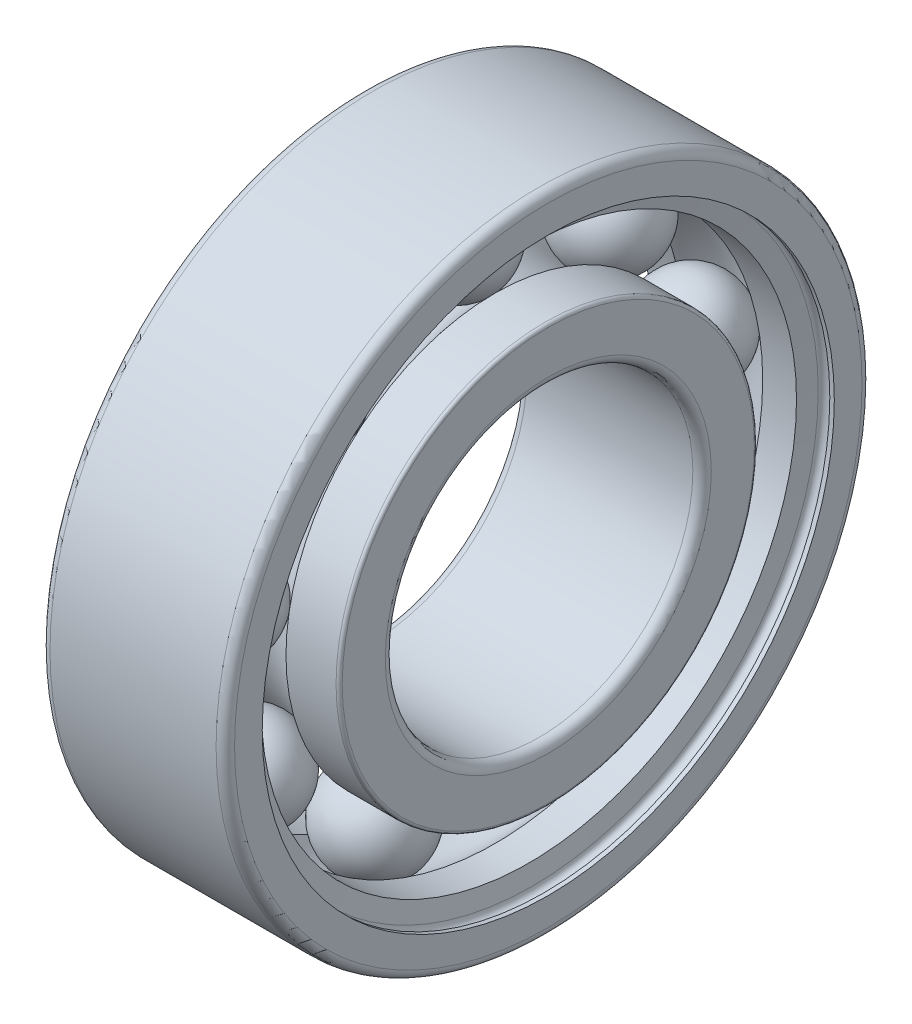
ISO-10303-21;
HEADER;
FILE_DESCRIPTION(('STEP AP214'),'2;1');
FILE_NAME('part.step','',(''),(''),'','','');
FILE_SCHEMA(('AUTOMOTIVE_DESIGN { 1 0 10303 214 1 1 1 1 }'));
ENDSEC;
DATA;
#1=APPLICATION_CONTEXT('core data for automotive mechanical design processes');
#2=APPLICATION_PROTOCOL_DEFINITION('international standard','automotive_design',2000,#1);
#3=PRODUCT_CONTEXT('',#1,'mechanical');
#4=PRODUCT('Part','Part','',(#3));
#5=PRODUCT_RELATED_PRODUCT_CATEGORY('part','',(#4));
#6=PRODUCT_DEFINITION_FORMATION('','',#4);
#7=PRODUCT_DEFINITION_CONTEXT('part definition',#1,'design');
#8=PRODUCT_DEFINITION('design','',#6,#7);
#9=PRODUCT_DEFINITION_SHAPE('','',#8);
#10=(LENGTH_UNIT() NAMED_UNIT(*) SI_UNIT(.MILLI.,.METRE.));
#11=(NAMED_UNIT(*) PLANE_ANGLE_UNIT() SI_UNIT($,.RADIAN.));
#12=(NAMED_UNIT(*) SI_UNIT($,.STERADIAN.) SOLID_ANGLE_UNIT());
#13=UNCERTAINTY_MEASURE_WITH_UNIT(LENGTH_MEASURE(1.E-05),#10,'distance_accuracy_value','');
#14=(GEOMETRIC_REPRESENTATION_CONTEXT(3) GLOBAL_UNCERTAINTY_ASSIGNED_CONTEXT((#13)) GLOBAL_UNIT_ASSIGNED_CONTEXT((#10,
#11,#12)) REPRESENTATION_CONTEXT('',''));
#15=CARTESIAN_POINT('',(0.,0.,0.));
#16=DIRECTION('',(0.,0.,1.));
#17=DIRECTION('',(1.,0.,0.));
#18=AXIS2_PLACEMENT_3D('',#15,#16,#17);
#19=CARTESIAN_POINT('',(0.599999999999877,0.,0.));
#20=DIRECTION('',(1.,0.,0.));
#21=DIRECTION('',(0.,0.,-1.));
#22=AXIS2_PLACEMENT_3D('',#19,#20,#21);
#23=TOROIDAL_SURFACE('',#22,10.5999999999999,0.599999999999877);
#24=CARTESIAN_POINT('',(0.6,0.,0.));
#25=DIRECTION('',(1.,0.,0.));
#26=DIRECTION('',(0.,0.,-1.));
#27=AXIS2_PLACEMENT_3D('',#24,#25,#26);
#28=CIRCLE('',#27,10.);
#29=CARTESIAN_POINT('',(0.6,0.,-10.));
#30=VERTEX_POINT('',#29);
#31=EDGE_CURVE('P0_E10',#30,#30,#28,.T.);
#32=ORIENTED_EDGE('',*,*,#31,.T.);
#33=EDGE_LOOP('',(#32));
#34=FACE_BOUND('',#33,.T.);
#35=CARTESIAN_POINT('',(0.,0.,0.));
#36=DIRECTION('',(1.,0.,0.));
#37=DIRECTION('',(0.,0.,-1.));
#38=AXIS2_PLACEMENT_3D('',#35,#36,#37);
#39=CIRCLE('',#38,10.6);
#40=CARTESIAN_POINT('',(0.,0.,-10.6));
#41=VERTEX_POINT('',#40);
#42=EDGE_CURVE('P0_E48',#41,#41,#39,.T.);
#43=ORIENTED_EDGE('',*,*,#42,.F.);
#44=EDGE_LOOP('',(#43));
#45=FACE_BOUND('',#44,.T.);
#46=ADVANCED_FACE('P0_F14',(#34,#45),#23,.T.);
#47=CARTESIAN_POINT('',(11.4,0.,0.));
#48=DIRECTION('',(1.,0.,0.));
#49=DIRECTION('',(0.,0.,-1.));
#50=AXIS2_PLACEMENT_3D('',#47,#48,#49);
#51=CYLINDRICAL_SURFACE('',#50,10.);
#52=CARTESIAN_POINT('',(11.4,0.,0.));
#53=DIRECTION('',(1.,0.,0.));
#54=DIRECTION('',(0.,0.,-1.));
#55=AXIS2_PLACEMENT_3D('',#52,#53,#54);
#56=CIRCLE('',#55,10.);
#57=CARTESIAN_POINT('',(11.4,0.,-10.));
#58=VERTEX_POINT('',#57);
#59=EDGE_CURVE('P0_E20',#58,#58,#56,.T.);
#60=ORIENTED_EDGE('',*,*,#59,.T.);
#61=EDGE_LOOP('',(#60));
#62=FACE_BOUND('',#61,.T.);
#63=ORIENTED_EDGE('',*,*,#31,.F.);
#64=EDGE_LOOP('',(#63));
#65=FACE_BOUND('',#64,.T.);
#66=ADVANCED_FACE('P0_F56',(#62,#65),#51,.F.);
#67=CARTESIAN_POINT('',(11.4000000000002,0.,0.));
#68=DIRECTION('',(1.,0.,0.));
#69=DIRECTION('',(0.,0.,-1.));
#70=AXIS2_PLACEMENT_3D('',#67,#68,#69);
#71=TOROIDAL_SURFACE('',#70,10.5999999999998,0.599999999999754);
#72=CARTESIAN_POINT('',(12.,0.,0.));
#73=DIRECTION('',(1.,0.,0.));
#74=DIRECTION('',(0.,0.,-1.));
#75=AXIS2_PLACEMENT_3D('',#72,#73,#74);
#76=CIRCLE('',#75,10.6);
#77=CARTESIAN_POINT('',(12.,0.,-10.6));
#78=VERTEX_POINT('',#77);
#79=EDGE_CURVE('P0_E24',#78,#78,#76,.T.);
#80=ORIENTED_EDGE('',*,*,#79,.T.);
#81=EDGE_LOOP('',(#80));
#82=FACE_BOUND('',#81,.T.);
#83=ORIENTED_EDGE('',*,*,#59,.F.);
#84=EDGE_LOOP('',(#83));
#85=FACE_BOUND('',#84,.T.);
#86=ADVANCED_FACE('P0_F61',(#82,#85),#71,.T.);
#87=CARTESIAN_POINT('',(12.,10.6,0.));
#88=DIRECTION('',(1.,0.,0.));
#89=DIRECTION('',(0.,0.,-1.));
#90=AXIS2_PLACEMENT_3D('',#87,#88,#89);
#91=PLANE('',#90);
#92=CARTESIAN_POINT('',(12.,0.,0.));
#93=DIRECTION('',(1.,0.,0.));
#94=DIRECTION('',(0.,0.,-1.));
#95=AXIS2_PLACEMENT_3D('',#92,#93,#94);
#96=CIRCLE('',#95,13.4);
#97=CARTESIAN_POINT('',(12.,0.,-13.4));
#98=VERTEX_POINT('',#97);
#99=EDGE_CURVE('P0_E28',#98,#98,#96,.T.);
#100=ORIENTED_EDGE('',*,*,#99,.T.);
#101=EDGE_LOOP('',(#100));
#102=FACE_BOUND('',#101,.T.);
#103=ORIENTED_EDGE('',*,*,#79,.F.);
#104=EDGE_LOOP('',(#103));
#105=FACE_BOUND('',#104,.T.);
#106=ADVANCED_FACE('P0_F65',(#102,#105),#91,.T.);
#107=CARTESIAN_POINT('',(11.7999999999989,0.,0.));
#108=DIRECTION('',(1.,0.,0.));
#109=DIRECTION('',(0.,0.,-1.));
#110=AXIS2_PLACEMENT_3D('',#107,#108,#109);
#111=TOROIDAL_SURFACE('',#110,13.3999999999989,0.200000000001057);
#112=CARTESIAN_POINT('',(11.8,0.,0.));
#113=DIRECTION('',(1.,0.,0.));
#114=DIRECTION('',(0.,0.,-1.));
#115=AXIS2_PLACEMENT_3D('',#112,#113,#114);
#116=CIRCLE('',#115,13.6);
#117=CARTESIAN_POINT('',(11.8,0.,-13.6));
#118=VERTEX_POINT('',#117);
#119=EDGE_CURVE('P0_E33',#118,#118,#116,.T.);
#120=ORIENTED_EDGE('',*,*,#119,.T.);
#121=EDGE_LOOP('',(#120));
#122=FACE_BOUND('',#121,.T.);
#123=ORIENTED_EDGE('',*,*,#99,.F.);
#124=EDGE_LOOP('',(#123));
#125=FACE_BOUND('',#124,.T.);
#126=ADVANCED_FACE('P0_F72',(#122,#125),#111,.T.);
#127=CARTESIAN_POINT('',(11.4,0.,0.));
#128=DIRECTION('',(1.,0.,0.));
#129=DIRECTION('',(0.,0.,-1.));
#130=AXIS2_PLACEMENT_3D('',#127,#128,#129);
#131=CYLINDRICAL_SURFACE('',#130,13.6);
#132=CARTESIAN_POINT('',(8.5437423218557,0.,0.));
#133=DIRECTION('',(1.,0.,0.));
#134=DIRECTION('',(0.,0.,-1.));
#135=AXIS2_PLACEMENT_3D('',#132,#133,#134);
#136=CIRCLE('',#135,13.6);
#137=CARTESIAN_POINT('',(8.5437423218557,0.,-13.6));
#138=VERTEX_POINT('',#137);
#139=EDGE_CURVE('P0_E36',#138,#138,#136,.T.);
#140=ORIENTED_EDGE('',*,*,#139,.T.);
#141=EDGE_LOOP('',(#140));
#142=FACE_BOUND('',#141,.T.);
#143=ORIENTED_EDGE('',*,*,#119,.F.);
#144=EDGE_LOOP('',(#143));
#145=FACE_BOUND('',#144,.T.);
#146=ADVANCED_FACE('P0_F76',(#142,#145),#131,.T.);
#147=CARTESIAN_POINT('',(6.,0.,0.));
#148=DIRECTION('',(1.,0.,0.));
#149=DIRECTION('',(0.,0.,-1.));
#150=AXIS2_PLACEMENT_3D('',#147,#148,#149);
#151=TOROIDAL_SURFACE('',#150,15.4999999999999,3.17499999999993);
#152=CARTESIAN_POINT('',(3.4562576781443,0.,0.));
#153=DIRECTION('',(1.,0.,0.));
#154=DIRECTION('',(0.,0.,-1.));
#155=AXIS2_PLACEMENT_3D('',#152,#153,#154);
#156=CIRCLE('',#155,13.6);
#157=CARTESIAN_POINT('',(3.4562576781443,0.,-13.6));
#158=VERTEX_POINT('',#157);
#159=EDGE_CURVE('P0_E39',#158,#158,#156,.T.);
#160=ORIENTED_EDGE('',*,*,#159,.T.);
#161=EDGE_LOOP('',(#160));
#162=FACE_BOUND('',#161,.T.);
#163=ORIENTED_EDGE('',*,*,#139,.F.);
#164=EDGE_LOOP('',(#163));
#165=FACE_BOUND('',#164,.T.);
#166=ADVANCED_FACE('P0_F80',(#162,#165),#151,.F.);
#167=CARTESIAN_POINT('',(11.4,0.,0.));
#168=DIRECTION('',(1.,0.,0.));
#169=DIRECTION('',(0.,0.,-1.));
#170=AXIS2_PLACEMENT_3D('',#167,#168,#169);
#171=CYLINDRICAL_SURFACE('',#170,13.6);
#172=CARTESIAN_POINT('',(0.200000000000001,0.,0.));
#173=DIRECTION('',(1.,0.,0.));
#174=DIRECTION('',(0.,0.,-1.));
#175=AXIS2_PLACEMENT_3D('',#172,#173,#174);
#176=CIRCLE('',#175,13.6);
#177=CARTESIAN_POINT('',(0.200000000000001,0.,-13.6));
#178=VERTEX_POINT('',#177);
#179=EDGE_CURVE('P0_E42',#178,#178,#176,.T.);
#180=ORIENTED_EDGE('',*,*,#179,.T.);
#181=EDGE_LOOP('',(#180));
#182=FACE_BOUND('',#181,.T.);
#183=ORIENTED_EDGE('',*,*,#159,.F.);
#184=EDGE_LOOP('',(#183));
#185=FACE_BOUND('',#184,.T.);
#186=ADVANCED_FACE('P0_F84',(#182,#185),#171,.T.);
#187=CARTESIAN_POINT('',(0.200000000000528,0.,0.));
#188=DIRECTION('',(1.,0.,0.));
#189=DIRECTION('',(0.,0.,-1.));
#190=AXIS2_PLACEMENT_3D('',#187,#188,#189);
#191=TOROIDAL_SURFACE('',#190,13.3999999999995,0.200000000000528);
#192=CARTESIAN_POINT('',(0.,0.,0.));
#193=DIRECTION('',(1.,0.,0.));
#194=DIRECTION('',(0.,0.,-1.));
#195=AXIS2_PLACEMENT_3D('',#192,#193,#194);
#196=CIRCLE('',#195,13.4);
#197=CARTESIAN_POINT('',(0.,0.,-13.4));
#198=VERTEX_POINT('',#197);
#199=EDGE_CURVE('P0_E45',#198,#198,#196,.T.);
#200=ORIENTED_EDGE('',*,*,#199,.T.);
#201=EDGE_LOOP('',(#200));
#202=FACE_BOUND('',#201,.T.);
#203=ORIENTED_EDGE('',*,*,#179,.F.);
#204=EDGE_LOOP('',(#203));
#205=FACE_BOUND('',#204,.T.);
#206=ADVANCED_FACE('P0_F88',(#202,#205),#191,.T.);
#207=CARTESIAN_POINT('',(0.,13.4,0.));
#208=DIRECTION('',(-1.,0.,0.));
#209=DIRECTION('',(0.,0.,1.));
#210=AXIS2_PLACEMENT_3D('',#207,#208,#209);
#211=PLANE('',#210);
#212=ORIENTED_EDGE('',*,*,#42,.T.);
#213=EDGE_LOOP('',(#212));
#214=FACE_BOUND('',#213,.T.);
#215=ORIENTED_EDGE('',*,*,#199,.F.);
#216=EDGE_LOOP('',(#215));
#217=FACE_BOUND('',#216,.T.);
#218=ADVANCED_FACE('P0_F52',(#214,#217),#211,.T.);
#219=CLOSED_SHELL('',(#46,#66,#86,#106,#126,#146,#166,#186,#206,#218));
#220=MANIFOLD_SOLID_BREP('P0_B1',#219);
#221=CARTESIAN_POINT('',(0.599999999999877,0.,0.));
#222=DIRECTION('',(1.,0.,0.));
#223=DIRECTION('',(0.,0.,-1.));
#224=AXIS2_PLACEMENT_3D('',#221,#222,#223);
#225=TOROIDAL_SURFACE('',#224,20.4000000000001,0.599999999999876);
#226=CARTESIAN_POINT('',(0.,0.,0.));
#227=DIRECTION('',(1.,0.,0.));
#228=DIRECTION('',(0.,0.,-1.));
#229=AXIS2_PLACEMENT_3D('',#226,#227,#228);
#230=CIRCLE('',#229,20.4);
#231=CARTESIAN_POINT('',(0.,0.,-20.4));
#232=VERTEX_POINT('',#231);
#233=EDGE_CURVE('P1_E10',#232,#232,#230,.T.);
#234=ORIENTED_EDGE('',*,*,#233,.T.);
#235=EDGE_LOOP('',(#234));
#236=FACE_BOUND('',#235,.T.);
#237=CARTESIAN_POINT('',(0.6,0.,0.));
#238=DIRECTION('',(1.,0.,0.));
#239=DIRECTION('',(0.,0.,-1.));
#240=AXIS2_PLACEMENT_3D('',#237,#238,#239);
#241=CIRCLE('',#240,21.);
#242=CARTESIAN_POINT('',(0.6,0.,-21.));
#243=VERTEX_POINT('',#242);
#244=EDGE_CURVE('P1_E60',#243,#243,#241,.T.);
#245=ORIENTED_EDGE('',*,*,#244,.F.);
#246=EDGE_LOOP('',(#245));
#247=FACE_BOUND('',#246,.T.);
#248=ADVANCED_FACE('P1_F14',(#236,#247),#225,.T.);
#249=CARTESIAN_POINT('',(0.,20.4,0.));
#250=DIRECTION('',(-1.,0.,0.));
#251=DIRECTION('',(0.,0.,1.));
#252=AXIS2_PLACEMENT_3D('',#249,#250,#251);
#253=PLANE('',#252);
#254=CARTESIAN_POINT('',(0.,0.,0.));
#255=DIRECTION('',(1.,0.,0.));
#256=DIRECTION('',(0.,0.,-1.));
#257=AXIS2_PLACEMENT_3D('',#254,#255,#256);
#258=CIRCLE('',#257,18.6);
#259=CARTESIAN_POINT('',(0.,0.,-18.6));
#260=VERTEX_POINT('',#259);
#261=EDGE_CURVE('P1_E20',#260,#260,#258,.T.);
#262=ORIENTED_EDGE('',*,*,#261,.T.);
#263=EDGE_LOOP('',(#262));
#264=FACE_BOUND('',#263,.T.);
#265=ORIENTED_EDGE('',*,*,#233,.F.);
#266=EDGE_LOOP('',(#265));
#267=FACE_BOUND('',#266,.T.);
#268=ADVANCED_FACE('P1_F68',(#264,#267),#253,.T.);
#269=CARTESIAN_POINT('',(11.4,0.,0.));
#270=DIRECTION('',(1.,0.,0.));
#271=DIRECTION('',(0.,0.,-1.));
#272=AXIS2_PLACEMENT_3D('',#269,#270,#271);
#273=CYLINDRICAL_SURFACE('',#272,18.6);
#274=CARTESIAN_POINT('',(0.293222222222221,0.,0.));
#275=DIRECTION('',(1.,0.,0.));
#276=DIRECTION('',(0.,0.,-1.));
#277=AXIS2_PLACEMENT_3D('',#274,#275,#276);
#278=CIRCLE('',#277,18.6);
#279=CARTESIAN_POINT('',(0.293222222222221,0.,-18.6));
#280=VERTEX_POINT('',#279);
#281=EDGE_CURVE('P1_E24',#280,#280,#278,.T.);
#282=ORIENTED_EDGE('',*,*,#281,.T.);
#283=EDGE_LOOP('',(#282));
#284=FACE_BOUND('',#283,.T.);
#285=ORIENTED_EDGE('',*,*,#261,.F.);
#286=EDGE_LOOP('',(#285));
#287=FACE_BOUND('',#286,.T.);
#288=ADVANCED_FACE('P1_F73',(#284,#287),#273,.F.);
#289=CARTESIAN_POINT('',(0.67022222222221,0.,0.));
#290=DIRECTION('',(1.,0.,0.));
#291=DIRECTION('',(0.,0.,-1.));
#292=AXIS2_PLACEMENT_3D('',#289,#290,#291);
#293=TOROIDAL_SURFACE('',#292,18.6,0.37699999999999);
#294=CARTESIAN_POINT('',(1.0472222222222,0.,0.));
#295=DIRECTION('',(1.,0.,0.));
#296=DIRECTION('',(0.,0.,-1.));
#297=AXIS2_PLACEMENT_3D('',#294,#295,#296);
#298=CIRCLE('',#297,18.6);
#299=CARTESIAN_POINT('',(1.0472222222222,0.,-18.6));
#300=VERTEX_POINT('',#299);
#301=EDGE_CURVE('P1_E28',#300,#300,#298,.T.);
#302=ORIENTED_EDGE('',*,*,#301,.T.);
#303=EDGE_LOOP('',(#302));
#304=FACE_BOUND('',#303,.T.);
#305=ORIENTED_EDGE('',*,*,#281,.F.);
#306=EDGE_LOOP('',(#305));
#307=FACE_BOUND('',#306,.T.);
#308=ADVANCED_FACE('P1_F77',(#304,#307),#293,.F.);
#309=CARTESIAN_POINT('',(1.0472222222222,0.,0.));
#310=DIRECTION('',(-1.,0.,0.));
#311=DIRECTION('',(0.,0.,1.));
#312=AXIS2_PLACEMENT_3D('',#309,#310,#311);
#313=CONICAL_SURFACE('',#312,18.6,1.39626340159543);
#314=CARTESIAN_POINT('',(1.2588145990724,0.,0.));
#315=DIRECTION('',(1.,0.,0.));
#316=DIRECTION('',(0.,0.,-1.));
#317=AXIS2_PLACEMENT_3D('',#314,#315,#316);
#318=CIRCLE('',#317,17.4);
#319=CARTESIAN_POINT('',(1.2588145990724,0.,-17.4));
#320=VERTEX_POINT('',#319);
#321=EDGE_CURVE('P1_E33',#320,#320,#318,.T.);
#322=ORIENTED_EDGE('',*,*,#321,.T.);
#323=EDGE_LOOP('',(#322));
#324=FACE_BOUND('',#323,.T.);
#325=ORIENTED_EDGE('',*,*,#301,.F.);
#326=EDGE_LOOP('',(#325));
#327=FACE_BOUND('',#326,.T.);
#328=ADVANCED_FACE('P1_F84',(#324,#327),#313,.F.);
#329=CARTESIAN_POINT('',(11.4,0.,0.));
#330=DIRECTION('',(1.,0.,0.));
#331=DIRECTION('',(0.,0.,-1.));
#332=AXIS2_PLACEMENT_3D('',#329,#330,#331);
#333=CYLINDRICAL_SURFACE('',#332,17.4);
#334=CARTESIAN_POINT('',(3.4562576781443,0.,0.));
#335=DIRECTION('',(1.,0.,0.));
#336=DIRECTION('',(0.,0.,-1.));
#337=AXIS2_PLACEMENT_3D('',#334,#335,#336);
#338=CIRCLE('',#337,17.4);
#339=CARTESIAN_POINT('',(3.4562576781443,0.,-17.4));
#340=VERTEX_POINT('',#339);
#341=EDGE_CURVE('P1_E36',#340,#340,#338,.T.);
#342=ORIENTED_EDGE('',*,*,#341,.T.);
#343=EDGE_LOOP('',(#342));
#344=FACE_BOUND('',#343,.T.);
#345=ORIENTED_EDGE('',*,*,#321,.F.);
#346=EDGE_LOOP('',(#345));
#347=FACE_BOUND('',#346,.T.);
#348=ADVANCED_FACE('P1_F88',(#344,#347),#333,.F.);
#349=CARTESIAN_POINT('',(6.,0.,0.));
#350=DIRECTION('',(1.,0.,0.));
#351=DIRECTION('',(0.,0.,-1.));
#352=AXIS2_PLACEMENT_3D('',#349,#350,#351);
#353=TOROIDAL_SURFACE('',#352,15.5000000000001,3.17499999999993);
#354=CARTESIAN_POINT('',(8.5437423218557,0.,0.));
#355=DIRECTION('',(1.,0.,0.));
#356=DIRECTION('',(0.,0.,-1.));
#357=AXIS2_PLACEMENT_3D('',#354,#355,#356);
#358=CIRCLE('',#357,17.4);
#359=CARTESIAN_POINT('',(8.5437423218557,0.,-17.4));
#360=VERTEX_POINT('',#359);
#361=EDGE_CURVE('P1_E39',#360,#360,#358,.T.);
#362=ORIENTED_EDGE('',*,*,#361,.T.);
#363=EDGE_LOOP('',(#362));
#364=FACE_BOUND('',#363,.T.);
#365=ORIENTED_EDGE('',*,*,#341,.F.);
#366=EDGE_LOOP('',(#365));
#367=FACE_BOUND('',#366,.T.);
#368=ADVANCED_FACE('P1_F92',(#364,#367),#353,.F.);
#369=CARTESIAN_POINT('',(11.4,0.,0.));
#370=DIRECTION('',(1.,0.,0.));
#371=DIRECTION('',(0.,0.,-1.));
#372=AXIS2_PLACEMENT_3D('',#369,#370,#371);
#373=CYLINDRICAL_SURFACE('',#372,17.4);
#374=CARTESIAN_POINT('',(10.741185400928,0.,0.));
#375=DIRECTION('',(1.,0.,0.));
#376=DIRECTION('',(0.,0.,-1.));
#377=AXIS2_PLACEMENT_3D('',#374,#375,#376);
#378=CIRCLE('',#377,17.4);
#379=CARTESIAN_POINT('',(10.741185400928,0.,-17.4));
#380=VERTEX_POINT('',#379);
#381=EDGE_CURVE('P1_E42',#380,#380,#378,.T.);
#382=ORIENTED_EDGE('',*,*,#381,.T.);
#383=EDGE_LOOP('',(#382));
#384=FACE_BOUND('',#383,.T.);
#385=ORIENTED_EDGE('',*,*,#361,.F.);
#386=EDGE_LOOP('',(#385));
#387=FACE_BOUND('',#386,.T.);
#388=ADVANCED_FACE('P1_F96',(#384,#387),#373,.F.);
#389=CARTESIAN_POINT('',(10.741185400928,0.,0.));
#390=DIRECTION('',(1.,0.,0.));
#391=DIRECTION('',(0.,0.,-1.));
#392=AXIS2_PLACEMENT_3D('',#389,#390,#391);
#393=CONICAL_SURFACE('',#392,17.4,1.39626340159559);
#394=CARTESIAN_POINT('',(10.952777777778,0.,0.));
#395=DIRECTION('',(1.,0.,0.));
#396=DIRECTION('',(0.,0.,-1.));
#397=AXIS2_PLACEMENT_3D('',#394,#395,#396);
#398=CIRCLE('',#397,18.6);
#399=CARTESIAN_POINT('',(10.952777777778,0.,-18.6));
#400=VERTEX_POINT('',#399);
#401=EDGE_CURVE('P1_E45',#400,#400,#398,.T.);
#402=ORIENTED_EDGE('',*,*,#401,.T.);
#403=EDGE_LOOP('',(#402));
#404=FACE_BOUND('',#403,.T.);
#405=ORIENTED_EDGE('',*,*,#381,.F.);
#406=EDGE_LOOP('',(#405));
#407=FACE_BOUND('',#406,.T.);
#408=ADVANCED_FACE('P1_F100',(#404,#407),#393,.F.);
#409=CARTESIAN_POINT('',(11.329777777778,0.,0.));
#410=DIRECTION('',(1.,0.,0.));
#411=DIRECTION('',(0.,0.,-1.));
#412=AXIS2_PLACEMENT_3D('',#409,#410,#411);
#413=TOROIDAL_SURFACE('',#412,18.6,0.377);
#414=CARTESIAN_POINT('',(11.706777777778,0.,0.));
#415=DIRECTION('',(1.,0.,0.));
#416=DIRECTION('',(0.,0.,-1.));
#417=AXIS2_PLACEMENT_3D('',#414,#415,#416);
#418=CIRCLE('',#417,18.6);
#419=CARTESIAN_POINT('',(11.706777777778,0.,-18.6));
#420=VERTEX_POINT('',#419);
#421=EDGE_CURVE('P1_E48',#420,#420,#418,.T.);
#422=ORIENTED_EDGE('',*,*,#421,.T.);
#423=EDGE_LOOP('',(#422));
#424=FACE_BOUND('',#423,.T.);
#425=ORIENTED_EDGE('',*,*,#401,.F.);
#426=EDGE_LOOP('',(#425));
#427=FACE_BOUND('',#426,.T.);
#428=ADVANCED_FACE('P1_F104',(#424,#427),#413,.F.);
#429=CARTESIAN_POINT('',(11.4,0.,0.));
#430=DIRECTION('',(1.,0.,0.));
#431=DIRECTION('',(0.,0.,-1.));
#432=AXIS2_PLACEMENT_3D('',#429,#430,#431);
#433=CYLINDRICAL_SURFACE('',#432,18.6);
#434=CARTESIAN_POINT('',(12.,0.,0.));
#435=DIRECTION('',(1.,0.,0.));
#436=DIRECTION('',(0.,0.,-1.));
#437=AXIS2_PLACEMENT_3D('',#434,#435,#436);
#438=CIRCLE('',#437,18.6);
#439=CARTESIAN_POINT('',(12.,0.,-18.6));
#440=VERTEX_POINT('',#439);
#441=EDGE_CURVE('P1_E51',#440,#440,#438,.T.);
#442=ORIENTED_EDGE('',*,*,#441,.T.);
#443=EDGE_LOOP('',(#442));
#444=FACE_BOUND('',#443,.T.);
#445=ORIENTED_EDGE('',*,*,#421,.F.);
#446=EDGE_LOOP('',(#445));
#447=FACE_BOUND('',#446,.T.);
#448=ADVANCED_FACE('P1_F108',(#444,#447),#433,.F.);
#449=CARTESIAN_POINT('',(12.,18.6,0.));
#450=DIRECTION('',(1.,0.,0.));
#451=DIRECTION('',(0.,0.,-1.));
#452=AXIS2_PLACEMENT_3D('',#449,#450,#451);
#453=PLANE('',#452);
#454=CARTESIAN_POINT('',(12.,0.,0.));
#455=DIRECTION('',(1.,0.,0.));
#456=DIRECTION('',(0.,0.,-1.));
#457=AXIS2_PLACEMENT_3D('',#454,#455,#456);
#458=CIRCLE('',#457,20.4);
#459=CARTESIAN_POINT('',(12.,0.,-20.4));
#460=VERTEX_POINT('',#459);
#461=EDGE_CURVE('P1_E54',#460,#460,#458,.T.);
#462=ORIENTED_EDGE('',*,*,#461,.T.);
#463=EDGE_LOOP('',(#462));
#464=FACE_BOUND('',#463,.T.);
#465=ORIENTED_EDGE('',*,*,#441,.F.);
#466=EDGE_LOOP('',(#465));
#467=FACE_BOUND('',#466,.T.);
#468=ADVANCED_FACE('P1_F112',(#464,#467),#453,.T.);
#469=CARTESIAN_POINT('',(11.4000000000002,0.,0.));
#470=DIRECTION('',(1.,0.,0.));
#471=DIRECTION('',(0.,0.,-1.));
#472=AXIS2_PLACEMENT_3D('',#469,#470,#471);
#473=TOROIDAL_SURFACE('',#472,20.4000000000003,0.599999999999755);
#474=CARTESIAN_POINT('',(11.4,0.,0.));
#475=DIRECTION('',(1.,0.,0.));
#476=DIRECTION('',(0.,0.,-1.));
#477=AXIS2_PLACEMENT_3D('',#474,#475,#476);
#478=CIRCLE('',#477,21.);
#479=CARTESIAN_POINT('',(11.4,0.,-21.));
#480=VERTEX_POINT('',#479);
#481=EDGE_CURVE('P1_E57',#480,#480,#478,.T.);
#482=ORIENTED_EDGE('',*,*,#481,.T.);
#483=EDGE_LOOP('',(#482));
#484=FACE_BOUND('',#483,.T.);
#485=ORIENTED_EDGE('',*,*,#461,.F.);
#486=EDGE_LOOP('',(#485));
#487=FACE_BOUND('',#486,.T.);
#488=ADVANCED_FACE('P1_F116',(#484,#487),#473,.T.);
#489=CARTESIAN_POINT('',(11.4,0.,0.));
#490=DIRECTION('',(1.,0.,0.));
#491=DIRECTION('',(0.,0.,-1.));
#492=AXIS2_PLACEMENT_3D('',#489,#490,#491);
#493=CYLINDRICAL_SURFACE('',#492,21.);
#494=ORIENTED_EDGE('',*,*,#244,.T.);
#495=EDGE_LOOP('',(#494));
#496=FACE_BOUND('',#495,.T.);
#497=ORIENTED_EDGE('',*,*,#481,.F.);
#498=EDGE_LOOP('',(#497));
#499=FACE_BOUND('',#498,.T.);
#500=ADVANCED_FACE('P1_F64',(#496,#499),#493,.T.);
#501=CLOSED_SHELL('',(#248,#268,#288,#308,#328,#348,#368,#388,#408,#428,#448,#468,#488,#500));
#502=MANIFOLD_SOLID_BREP('P1_B1',#501);
#503=CARTESIAN_POINT('',(6.,15.5,0.));
#504=DIRECTION('',(1.,0.,0.));
#505=DIRECTION('',(0.,1.,0.));
#506=AXIS2_PLACEMENT_3D('',#503,#504,#505);
#507=SPHERICAL_SURFACE('',#506,3.175);
#508=CARTESIAN_POINT('',(9.175,15.5,0.));
#509=VERTEX_POINT('',#508);
#510=VERTEX_LOOP('',#509);
#511=FACE_BOUND('',#510,.T.);
#512=ADVANCED_FACE('P2_F12',(#511),#507,.T.);
#513=CLOSED_SHELL('',(#512));
#514=MANIFOLD_SOLID_BREP('P2_B1',#513);
#515=CARTESIAN_POINT('',(6.,11.8736888683442,-9.96320795014135));
#516=DIRECTION('',(1.,0.,0.));
#517=DIRECTION('',(0.,0.766044443118978,-0.642787609686539));
#518=AXIS2_PLACEMENT_3D('',#515,#516,#517);
#519=SPHERICAL_SURFACE('',#518,3.175);
#520=CARTESIAN_POINT('',(9.175,11.8736888683442,-9.96320795014135));
#521=VERTEX_POINT('',#520);
#522=VERTEX_LOOP('',#521);
#523=FACE_BOUND('',#522,.T.);
#524=ADVANCED_FACE('P3_F12',(#523),#519,.T.);
#525=CLOSED_SHELL('',(#524));
#526=MANIFOLD_SOLID_BREP('P3_B1',#525);
#527=CARTESIAN_POINT('',(6.,2.69154675383741,-15.2645201716892));
#528=DIRECTION('',(1.,0.,0.));
#529=DIRECTION('',(0.,0.17364817766693,-0.984807753012208));
#530=AXIS2_PLACEMENT_3D('',#527,#528,#529);
#531=SPHERICAL_SURFACE('',#530,3.175);
#532=CARTESIAN_POINT('',(9.175,2.69154675383741,-15.2645201716892));
#533=VERTEX_POINT('',#532);
#534=VERTEX_LOOP('',#533);
#535=FACE_BOUND('',#534,.T.);
#536=ADVANCED_FACE('P4_F12',(#535),#531,.T.);
#537=CLOSED_SHELL('',(#536));
#538=MANIFOLD_SOLID_BREP('P4_B1',#537);
#539=CARTESIAN_POINT('',(6.,-7.74999999999999,-13.4233937586588));
#540=DIRECTION('',(1.,0.,0.));
#541=DIRECTION('',(0.,-0.499999999999999,-0.866025403784439));
#542=AXIS2_PLACEMENT_3D('',#539,#540,#541);
#543=SPHERICAL_SURFACE('',#542,3.175);
#544=CARTESIAN_POINT('',(9.175,-7.74999999999999,-13.4233937586588));
#545=VERTEX_POINT('',#544);
#546=VERTEX_LOOP('',#545);
#547=FACE_BOUND('',#546,.T.);
#548=ADVANCED_FACE('P5_F12',(#547),#543,.T.);
#549=CLOSED_SHELL('',(#548));
#550=MANIFOLD_SOLID_BREP('P5_B1',#549);
#551=CARTESIAN_POINT('',(6.,-14.5652356221816,-5.30131222154787));
#552=DIRECTION('',(1.,0.,0.));
#553=DIRECTION('',(0.,-0.939692620785908,-0.342020143325669));
#554=AXIS2_PLACEMENT_3D('',#551,#552,#553);
#555=SPHERICAL_SURFACE('',#554,3.175);
#556=CARTESIAN_POINT('',(9.175,-14.5652356221816,-5.30131222154787));
#557=VERTEX_POINT('',#556);
#558=VERTEX_LOOP('',#557);
#559=FACE_BOUND('',#558,.T.);
#560=ADVANCED_FACE('P6_F12',(#559),#555,.T.);
#561=CLOSED_SHELL('',(#560));
#562=MANIFOLD_SOLID_BREP('P6_B1',#561);
#563=CARTESIAN_POINT('',(6.,-14.5652356221816,5.30131222154787));
#564=DIRECTION('',(1.,0.,0.));
#565=DIRECTION('',(0.,-0.939692620785908,0.342020143325669));
#566=AXIS2_PLACEMENT_3D('',#563,#564,#565);
#567=SPHERICAL_SURFACE('',#566,3.175);
#568=CARTESIAN_POINT('',(9.175,-14.5652356221816,5.30131222154787));
#569=VERTEX_POINT('',#568);
#570=VERTEX_LOOP('',#569);
#571=FACE_BOUND('',#570,.T.);
#572=ADVANCED_FACE('P7_F12',(#571),#567,.T.);
#573=CLOSED_SHELL('',(#572));
#574=MANIFOLD_SOLID_BREP('P7_B1',#573);
#575=CARTESIAN_POINT('',(6.,-7.74999999999999,13.4233937586588));
#576=DIRECTION('',(1.,0.,0.));
#577=DIRECTION('',(0.,-0.499999999999999,0.866025403784439));
#578=AXIS2_PLACEMENT_3D('',#575,#576,#577);
#579=SPHERICAL_SURFACE('',#578,3.175);
#580=CARTESIAN_POINT('',(9.175,-7.74999999999999,13.4233937586588));
#581=VERTEX_POINT('',#580);
#582=VERTEX_LOOP('',#581);
#583=FACE_BOUND('',#582,.T.);
#584=ADVANCED_FACE('P8_F12',(#583),#579,.T.);
#585=CLOSED_SHELL('',(#584));
#586=MANIFOLD_SOLID_BREP('P8_B1',#585);
#587=CARTESIAN_POINT('',(6.,2.69154675383741,15.2645201716892));
#588=DIRECTION('',(1.,0.,0.));
#589=DIRECTION('',(0.,0.17364817766693,0.984807753012208));
#590=AXIS2_PLACEMENT_3D('',#587,#588,#589);
#591=SPHERICAL_SURFACE('',#590,3.175);
#592=CARTESIAN_POINT('',(9.175,2.69154675383741,15.2645201716892));
#593=VERTEX_POINT('',#592);
#594=VERTEX_LOOP('',#593);
#595=FACE_BOUND('',#594,.T.);
#596=ADVANCED_FACE('P9_F12',(#595),#591,.T.);
#597=CLOSED_SHELL('',(#596));
#598=MANIFOLD_SOLID_BREP('P9_B1',#597);
#599=CARTESIAN_POINT('',(6.,11.8736888683442,9.96320795014135));
#600=DIRECTION('',(1.,0.,0.));
#601=DIRECTION('',(0.,0.766044443118978,0.642787609686539));
#602=AXIS2_PLACEMENT_3D('',#599,#600,#601);
#603=SPHERICAL_SURFACE('',#602,3.175);
#604=CARTESIAN_POINT('',(9.175,11.8736888683442,9.96320795014135));
#605=VERTEX_POINT('',#604);
#606=VERTEX_LOOP('',#605);
#607=FACE_BOUND('',#606,.T.);
#608=ADVANCED_FACE('P10_F12',(#607),#603,.T.);
#609=CLOSED_SHELL('',(#608));
#610=MANIFOLD_SOLID_BREP('P10_B1',#609);
#611=ADVANCED_BREP_SHAPE_REPRESENTATION('',(#18,#220,#502,#514,#526,#538,#550,#562,#574,#586,
#598,#610),#14);
#612=SHAPE_DEFINITION_REPRESENTATION(#9,#611);
ENDSEC;
END-ISO-10303-21;
